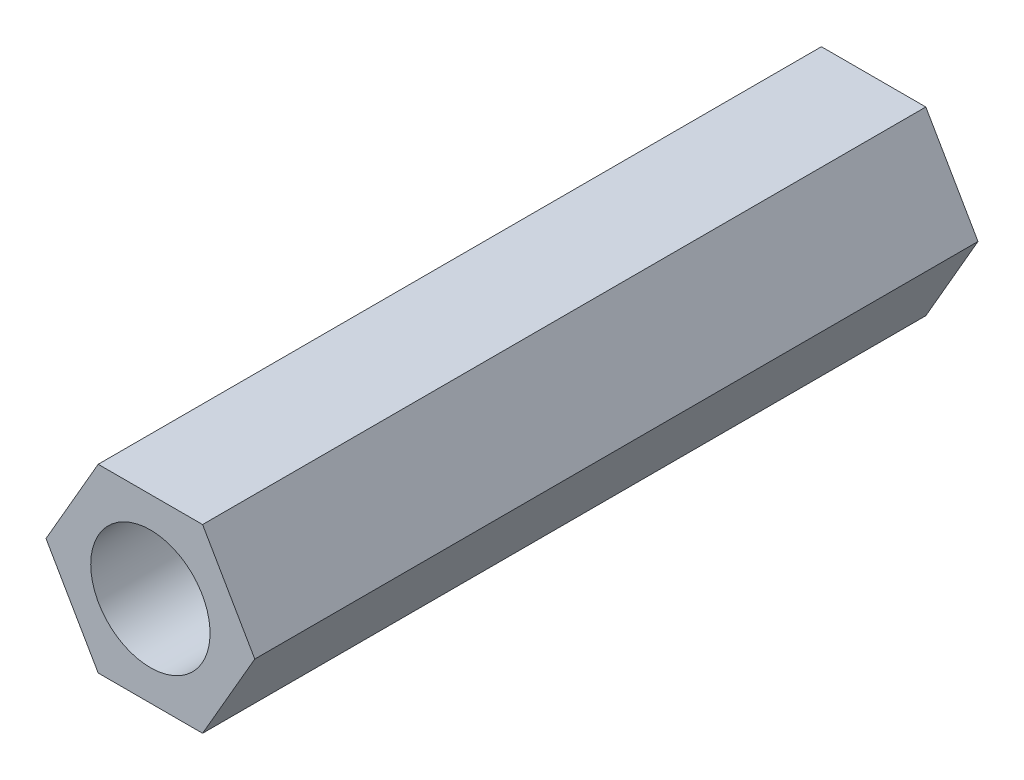
ISO-10303-21;
HEADER;
FILE_DESCRIPTION(('STEP AP214'),'2;1');
FILE_NAME('part.step','',(''),(''),'','','');
FILE_SCHEMA(('AUTOMOTIVE_DESIGN { 1 0 10303 214 1 1 1 1 }'));
ENDSEC;
DATA;
#1=APPLICATION_CONTEXT('core data for automotive mechanical design processes');
#2=APPLICATION_PROTOCOL_DEFINITION('international standard','automotive_design',2000,#1);
#3=PRODUCT_CONTEXT('',#1,'mechanical');
#4=PRODUCT('Part','Part','',(#3));
#5=PRODUCT_RELATED_PRODUCT_CATEGORY('part','',(#4));
#6=PRODUCT_DEFINITION_FORMATION('','',#4);
#7=PRODUCT_DEFINITION_CONTEXT('part definition',#1,'design');
#8=PRODUCT_DEFINITION('design','',#6,#7);
#9=PRODUCT_DEFINITION_SHAPE('','',#8);
#10=(LENGTH_UNIT() NAMED_UNIT(*) SI_UNIT(.MILLI.,.METRE.));
#11=(NAMED_UNIT(*) PLANE_ANGLE_UNIT() SI_UNIT($,.RADIAN.));
#12=(NAMED_UNIT(*) SI_UNIT($,.STERADIAN.) SOLID_ANGLE_UNIT());
#13=UNCERTAINTY_MEASURE_WITH_UNIT(LENGTH_MEASURE(1.E-05),#10,'distance_accuracy_value','');
#14=(GEOMETRIC_REPRESENTATION_CONTEXT(3) GLOBAL_UNCERTAINTY_ASSIGNED_CONTEXT((#13)) GLOBAL_UNIT_ASSIGNED_CONTEXT((#10,
#11,#12)) REPRESENTATION_CONTEXT('',''));
#15=CARTESIAN_POINT('',(0.,0.,0.));
#16=DIRECTION('',(0.,0.,1.));
#17=DIRECTION('',(1.,0.,0.));
#18=AXIS2_PLACEMENT_3D('',#15,#16,#17);
#19=CARTESIAN_POINT('',(1.83308710467706,3.175,12.7));
#20=DIRECTION('',(0.,-1.,0.));
#21=DIRECTION('',(0.,0.,-1.));
#22=AXIS2_PLACEMENT_3D('',#19,#20,#21);
#23=PLANE('',#22);
#24=DIRECTION('',(0.,0.,1.));
#25=VECTOR('',#24,1.);
#26=CARTESIAN_POINT('',(-1.83308710467706,3.175,12.7));
#27=LINE('',#26,#25);
#28=CARTESIAN_POINT('',(-1.83308710467706,3.175,-12.7));
#29=VERTEX_POINT('',#28);
#30=CARTESIAN_POINT('',(-1.83308710467706,3.175,12.7));
#31=VERTEX_POINT('',#30);
#32=EDGE_CURVE('E66',#29,#31,#27,.T.);
#33=ORIENTED_EDGE('',*,*,#32,.T.);
#34=DIRECTION('',(1.,0.,0.));
#35=VECTOR('',#34,1.);
#36=CARTESIAN_POINT('',(-5.49926131403119,3.175,12.7));
#37=LINE('',#36,#35);
#38=CARTESIAN_POINT('',(1.83308710467706,3.175,12.7));
#39=VERTEX_POINT('',#38);
#40=EDGE_CURVE('E106',#39,#31,#37,.F.);
#41=ORIENTED_EDGE('',*,*,#40,.F.);
#42=DIRECTION('',(0.,0.,1.));
#43=VECTOR('',#42,1.);
#44=CARTESIAN_POINT('',(1.83308710467706,3.175,12.7));
#45=LINE('',#44,#43);
#46=CARTESIAN_POINT('',(1.83308710467706,3.175,-12.7));
#47=VERTEX_POINT('',#46);
#48=EDGE_CURVE('E93',#39,#47,#45,.F.);
#49=ORIENTED_EDGE('',*,*,#48,.T.);
#50=DIRECTION('',(1.,0.,0.));
#51=VECTOR('',#50,1.);
#52=CARTESIAN_POINT('',(-5.49926131403119,3.175,-12.7));
#53=LINE('',#52,#51);
#54=EDGE_CURVE('E107',#47,#29,#53,.F.);
#55=ORIENTED_EDGE('',*,*,#54,.T.);
#56=EDGE_LOOP('',(#33,#41,#49,#55));
#57=FACE_BOUND('',#56,.T.);
#58=ADVANCED_FACE('F17',(#57),#23,.F.);
#59=CARTESIAN_POINT('',(-1.83308710467706,3.175,12.7));
#60=DIRECTION('',(0.866025403784439,-0.5,0.));
#61=DIRECTION('',(0.5,0.866025403784439,0.));
#62=AXIS2_PLACEMENT_3D('',#59,#60,#61);
#63=PLANE('',#62);
#64=DIRECTION('',(0.,0.,1.));
#65=VECTOR('',#64,1.);
#66=CARTESIAN_POINT('',(-3.66617420935413,0.,12.7));
#67=LINE('',#66,#65);
#68=CARTESIAN_POINT('',(-3.66617420935413,0.,-12.7));
#69=VERTEX_POINT('',#68);
#70=CARTESIAN_POINT('',(-3.66617420935413,0.,12.7));
#71=VERTEX_POINT('',#70);
#72=EDGE_CURVE('E73',#69,#71,#67,.T.);
#73=ORIENTED_EDGE('',*,*,#72,.T.);
#74=DIRECTION('',(-0.5,-0.866025403784439,0.));
#75=VECTOR('',#74,1.);
#76=CARTESIAN_POINT('',(-1.83308710467706,3.175,12.7));
#77=LINE('',#76,#75);
#78=EDGE_CURVE('E108',#31,#71,#77,.T.);
#79=ORIENTED_EDGE('',*,*,#78,.F.);
#80=ORIENTED_EDGE('',*,*,#32,.F.);
#81=DIRECTION('',(-0.5,-0.866025403784439,0.));
#82=VECTOR('',#81,1.);
#83=CARTESIAN_POINT('',(-1.83308710467706,3.175,-12.7));
#84=LINE('',#83,#82);
#85=EDGE_CURVE('E86',#29,#69,#84,.T.);
#86=ORIENTED_EDGE('',*,*,#85,.T.);
#87=EDGE_LOOP('',(#73,#79,#80,#86));
#88=FACE_BOUND('',#87,.T.);
#89=ADVANCED_FACE('F92',(#88),#63,.F.);
#90=CARTESIAN_POINT('',(-3.66617420935413,0.,12.7));
#91=DIRECTION('',(0.866025403784439,0.5,0.));
#92=DIRECTION('',(-0.5,0.866025403784439,0.));
#93=AXIS2_PLACEMENT_3D('',#90,#91,#92);
#94=PLANE('',#93);
#95=DIRECTION('',(0.,0.,1.));
#96=VECTOR('',#95,1.);
#97=CARTESIAN_POINT('',(-1.83308710467706,-3.175,12.7));
#98=LINE('',#97,#96);
#99=CARTESIAN_POINT('',(-1.83308710467706,-3.175,-12.7));
#100=VERTEX_POINT('',#99);
#101=CARTESIAN_POINT('',(-1.83308710467706,-3.175,12.7));
#102=VERTEX_POINT('',#101);
#103=EDGE_CURVE('E79',#100,#102,#98,.T.);
#104=ORIENTED_EDGE('',*,*,#103,.T.);
#105=DIRECTION('',(0.5,-0.866025403784439,0.));
#106=VECTOR('',#105,1.);
#107=CARTESIAN_POINT('',(-3.66617420935413,0.,12.7));
#108=LINE('',#107,#106);
#109=EDGE_CURVE('E78',#71,#102,#108,.T.);
#110=ORIENTED_EDGE('',*,*,#109,.F.);
#111=ORIENTED_EDGE('',*,*,#72,.F.);
#112=DIRECTION('',(0.5,-0.866025403784439,0.));
#113=VECTOR('',#112,1.);
#114=CARTESIAN_POINT('',(-3.66617420935413,0.,-12.7));
#115=LINE('',#114,#113);
#116=EDGE_CURVE('E77',#69,#100,#115,.T.);
#117=ORIENTED_EDGE('',*,*,#116,.T.);
#118=EDGE_LOOP('',(#104,#110,#111,#117));
#119=FACE_BOUND('',#118,.T.);
#120=ADVANCED_FACE('F76',(#119),#94,.F.);
#121=CARTESIAN_POINT('',(-1.83308710467706,-3.175,12.7));
#122=DIRECTION('',(0.,1.,0.));
#123=DIRECTION('',(0.,0.,1.));
#124=AXIS2_PLACEMENT_3D('',#121,#122,#123);
#125=PLANE('',#124);
#126=DIRECTION('',(0.,0.,1.));
#127=VECTOR('',#126,1.);
#128=CARTESIAN_POINT('',(1.83308710467706,-3.175,12.7));
#129=LINE('',#128,#127);
#130=CARTESIAN_POINT('',(1.83308710467706,-3.175,-12.7));
#131=VERTEX_POINT('',#130);
#132=CARTESIAN_POINT('',(1.83308710467706,-3.175,12.7));
#133=VERTEX_POINT('',#132);
#134=EDGE_CURVE('E100',#131,#133,#129,.T.);
#135=ORIENTED_EDGE('',*,*,#134,.T.);
#136=DIRECTION('',(1.,0.,0.));
#137=VECTOR('',#136,1.);
#138=CARTESIAN_POINT('',(-5.49926131403119,-3.175,12.7));
#139=LINE('',#138,#137);
#140=EDGE_CURVE('E110',#102,#133,#139,.T.);
#141=ORIENTED_EDGE('',*,*,#140,.F.);
#142=ORIENTED_EDGE('',*,*,#103,.F.);
#143=DIRECTION('',(1.,0.,0.));
#144=VECTOR('',#143,1.);
#145=CARTESIAN_POINT('',(-5.49926131403119,-3.175,-12.7));
#146=LINE('',#145,#144);
#147=EDGE_CURVE('E90',#100,#131,#146,.T.);
#148=ORIENTED_EDGE('',*,*,#147,.T.);
#149=EDGE_LOOP('',(#135,#141,#142,#148));
#150=FACE_BOUND('',#149,.T.);
#151=ADVANCED_FACE('F122',(#150),#125,.F.);
#152=CARTESIAN_POINT('',(1.83308710467706,-3.175,12.7));
#153=DIRECTION('',(-0.866025403784439,0.5,0.));
#154=DIRECTION('',(-0.5,-0.866025403784439,0.));
#155=AXIS2_PLACEMENT_3D('',#152,#153,#154);
#156=PLANE('',#155);
#157=DIRECTION('',(0.,0.,1.));
#158=VECTOR('',#157,1.);
#159=CARTESIAN_POINT('',(3.66617420935412,0.,12.7));
#160=LINE('',#159,#158);
#161=CARTESIAN_POINT('',(3.66617420935412,0.,-12.7));
#162=VERTEX_POINT('',#161);
#163=CARTESIAN_POINT('',(3.66617420935412,0.,12.7));
#164=VERTEX_POINT('',#163);
#165=EDGE_CURVE('E95',#162,#164,#160,.T.);
#166=ORIENTED_EDGE('',*,*,#165,.T.);
#167=DIRECTION('',(0.5,0.866025403784439,0.));
#168=VECTOR('',#167,1.);
#169=CARTESIAN_POINT('',(1.83308710467706,-3.175,12.7));
#170=LINE('',#169,#168);
#171=EDGE_CURVE('E33',#133,#164,#170,.T.);
#172=ORIENTED_EDGE('',*,*,#171,.F.);
#173=ORIENTED_EDGE('',*,*,#134,.F.);
#174=DIRECTION('',(0.5,0.866025403784439,0.));
#175=VECTOR('',#174,1.);
#176=CARTESIAN_POINT('',(1.83308710467706,-3.175,-12.7));
#177=LINE('',#176,#175);
#178=EDGE_CURVE('E119',#131,#162,#177,.T.);
#179=ORIENTED_EDGE('',*,*,#178,.T.);
#180=EDGE_LOOP('',(#166,#172,#173,#179));
#181=FACE_BOUND('',#180,.T.);
#182=ADVANCED_FACE('F150',(#181),#156,.F.);
#183=CARTESIAN_POINT('',(3.66617420935412,0.,12.7));
#184=DIRECTION('',(-0.866025403784439,-0.5,0.));
#185=DIRECTION('',(0.5,-0.866025403784439,0.));
#186=AXIS2_PLACEMENT_3D('',#183,#184,#185);
#187=PLANE('',#186);
#188=ORIENTED_EDGE('',*,*,#48,.F.);
#189=DIRECTION('',(-0.5,0.866025403784439,0.));
#190=VECTOR('',#189,1.);
#191=CARTESIAN_POINT('',(3.66617420935412,0.,12.7));
#192=LINE('',#191,#190);
#193=EDGE_CURVE('E124',#164,#39,#192,.T.);
#194=ORIENTED_EDGE('',*,*,#193,.F.);
#195=ORIENTED_EDGE('',*,*,#165,.F.);
#196=DIRECTION('',(-0.5,0.866025403784439,0.));
#197=VECTOR('',#196,1.);
#198=CARTESIAN_POINT('',(3.66617420935412,0.,-12.7));
#199=LINE('',#198,#197);
#200=EDGE_CURVE('E116',#162,#47,#199,.T.);
#201=ORIENTED_EDGE('',*,*,#200,.T.);
#202=EDGE_LOOP('',(#188,#194,#195,#201));
#203=FACE_BOUND('',#202,.T.);
#204=ADVANCED_FACE('F147',(#203),#187,.F.);
#205=CARTESIAN_POINT('',(-5.49926131403119,3.175,-12.7));
#206=DIRECTION('',(0.,0.,1.));
#207=DIRECTION('',(1.,0.,0.));
#208=AXIS2_PLACEMENT_3D('',#205,#206,#207);
#209=PLANE('',#208);
#210=CARTESIAN_POINT('',(0.,0.,-12.7));
#211=DIRECTION('',(0.,0.,-1.));
#212=DIRECTION('',(-1.,0.,0.));
#213=AXIS2_PLACEMENT_3D('',#210,#211,#212);
#214=CIRCLE('',#213,2.0955);
#215=CARTESIAN_POINT('',(-2.0955,0.,-12.7));
#216=VERTEX_POINT('',#215);
#217=EDGE_CURVE('E20',#216,#216,#214,.F.);
#218=ORIENTED_EDGE('',*,*,#217,.T.);
#219=EDGE_LOOP('',(#218));
#220=FACE_BOUND('',#219,.T.);
#221=ORIENTED_EDGE('',*,*,#200,.F.);
#222=ORIENTED_EDGE('',*,*,#178,.F.);
#223=ORIENTED_EDGE('',*,*,#147,.F.);
#224=ORIENTED_EDGE('',*,*,#116,.F.);
#225=ORIENTED_EDGE('',*,*,#85,.F.);
#226=ORIENTED_EDGE('',*,*,#54,.F.);
#227=EDGE_LOOP('',(#221,#222,#223,#224,#225,#226));
#228=FACE_BOUND('',#227,.T.);
#229=ADVANCED_FACE('F84',(#220,#228),#209,.F.);
#230=CARTESIAN_POINT('',(-5.49926131403119,3.175,12.7));
#231=DIRECTION('',(0.,0.,1.));
#232=DIRECTION('',(1.,0.,0.));
#233=AXIS2_PLACEMENT_3D('',#230,#231,#232);
#234=PLANE('',#233);
#235=CARTESIAN_POINT('',(0.,0.,12.7));
#236=DIRECTION('',(0.,0.,-1.));
#237=DIRECTION('',(-1.,0.,0.));
#238=AXIS2_PLACEMENT_3D('',#235,#236,#237);
#239=CIRCLE('',#238,2.0955);
#240=CARTESIAN_POINT('',(-2.0955,0.,12.7));
#241=VERTEX_POINT('',#240);
#242=EDGE_CURVE('E11',#241,#241,#239,.T.);
#243=ORIENTED_EDGE('',*,*,#242,.T.);
#244=EDGE_LOOP('',(#243));
#245=FACE_BOUND('',#244,.T.);
#246=ORIENTED_EDGE('',*,*,#171,.T.);
#247=ORIENTED_EDGE('',*,*,#193,.T.);
#248=ORIENTED_EDGE('',*,*,#40,.T.);
#249=ORIENTED_EDGE('',*,*,#78,.T.);
#250=ORIENTED_EDGE('',*,*,#109,.T.);
#251=ORIENTED_EDGE('',*,*,#140,.T.);
#252=EDGE_LOOP('',(#246,#247,#248,#249,#250,#251));
#253=FACE_BOUND('',#252,.T.);
#254=ADVANCED_FACE('F134',(#245,#253),#234,.T.);
#255=CARTESIAN_POINT('',(0.,0.,12.7));
#256=DIRECTION('',(0.,0.,-1.));
#257=DIRECTION('',(-1.,0.,0.));
#258=AXIS2_PLACEMENT_3D('',#255,#256,#257);
#259=CYLINDRICAL_SURFACE('',#258,2.0955);
#260=ORIENTED_EDGE('',*,*,#242,.F.);
#261=EDGE_LOOP('',(#260));
#262=FACE_BOUND('',#261,.T.);
#263=ORIENTED_EDGE('',*,*,#217,.F.);
#264=EDGE_LOOP('',(#263));
#265=FACE_BOUND('',#264,.T.);
#266=ADVANCED_FACE('F132',(#262,#265),#259,.F.);
#267=CLOSED_SHELL('',(#58,#89,#120,#151,#182,#204,#229,#254,#266));
#268=MANIFOLD_SOLID_BREP('B1',#267);
#269=ADVANCED_BREP_SHAPE_REPRESENTATION('',(#18,#268),#14);
#270=SHAPE_DEFINITION_REPRESENTATION(#9,#269);
ENDSEC;
END-ISO-10303-21;
